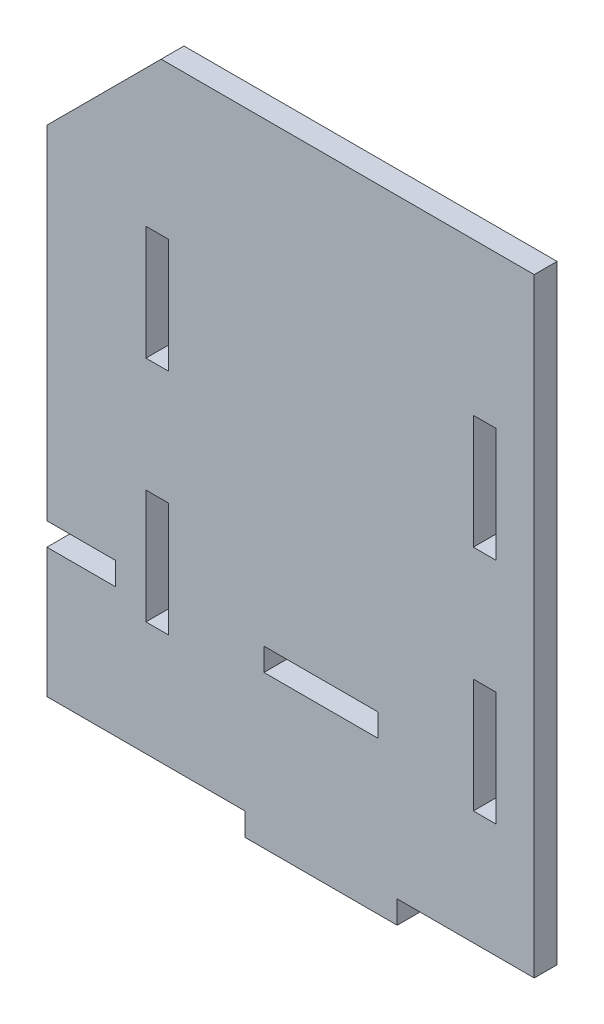
ISO-10303-21;
HEADER;
FILE_DESCRIPTION(('STEP AP214'),'2;1');
FILE_NAME('part.step','',(''),(''),'','','');
FILE_SCHEMA(('AUTOMOTIVE_DESIGN { 1 0 10303 214 1 1 1 1 }'));
ENDSEC;
DATA;
#1=APPLICATION_CONTEXT('core data for automotive mechanical design processes');
#2=APPLICATION_PROTOCOL_DEFINITION('international standard','automotive_design',2000,#1);
#3=PRODUCT_CONTEXT('',#1,'mechanical');
#4=PRODUCT('Part','Part','',(#3));
#5=PRODUCT_RELATED_PRODUCT_CATEGORY('part','',(#4));
#6=PRODUCT_DEFINITION_FORMATION('','',#4);
#7=PRODUCT_DEFINITION_CONTEXT('part definition',#1,'design');
#8=PRODUCT_DEFINITION('design','',#6,#7);
#9=PRODUCT_DEFINITION_SHAPE('','',#8);
#10=(LENGTH_UNIT() NAMED_UNIT(*) SI_UNIT(.MILLI.,.METRE.));
#11=(NAMED_UNIT(*) PLANE_ANGLE_UNIT() SI_UNIT($,.RADIAN.));
#12=(NAMED_UNIT(*) SI_UNIT($,.STERADIAN.) SOLID_ANGLE_UNIT());
#13=UNCERTAINTY_MEASURE_WITH_UNIT(LENGTH_MEASURE(1.E-05),#10,'distance_accuracy_value','');
#14=(GEOMETRIC_REPRESENTATION_CONTEXT(3) GLOBAL_UNCERTAINTY_ASSIGNED_CONTEXT((#13)) GLOBAL_UNIT_ASSIGNED_CONTEXT((#10,
#11,#12)) REPRESENTATION_CONTEXT('',''));
#15=CARTESIAN_POINT('',(0.,0.,0.));
#16=DIRECTION('',(0.,0.,1.));
#17=DIRECTION('',(1.,0.,0.));
#18=AXIS2_PLACEMENT_3D('',#15,#16,#17);
#19=CARTESIAN_POINT('',(-36.,-40.,0.));
#20=DIRECTION('',(-1.,0.,0.));
#21=DIRECTION('',(0.,0.,1.));
#22=AXIS2_PLACEMENT_3D('',#19,#20,#21);
#23=PLANE('',#22);
#24=DIRECTION('',(0.,-1.,0.));
#25=VECTOR('',#24,1.);
#26=CARTESIAN_POINT('',(-36.,-40.,3.));
#27=LINE('',#26,#25);
#28=CARTESIAN_POINT('',(-36.,24.9999999999999,3.));
#29=VERTEX_POINT('',#28);
#30=CARTESIAN_POINT('',(-36.,-20.,3.));
#31=VERTEX_POINT('',#30);
#32=EDGE_CURVE('E327',#29,#31,#27,.T.);
#33=ORIENTED_EDGE('',*,*,#32,.F.);
#34=DIRECTION('',(0.,0.,-1.));
#35=VECTOR('',#34,1.);
#36=CARTESIAN_POINT('',(-36.,24.9999999999999,0.));
#37=LINE('',#36,#35);
#38=CARTESIAN_POINT('',(-36.,24.9999999999999,0.));
#39=VERTEX_POINT('',#38);
#40=EDGE_CURVE('E78',#29,#39,#37,.T.);
#41=ORIENTED_EDGE('',*,*,#40,.T.);
#42=DIRECTION('',(0.,-1.,0.));
#43=VECTOR('',#42,1.);
#44=CARTESIAN_POINT('',(-36.,-40.,0.));
#45=LINE('',#44,#43);
#46=CARTESIAN_POINT('',(-36.,-20.,0.));
#47=VERTEX_POINT('',#46);
#48=EDGE_CURVE('E324',#39,#47,#45,.T.);
#49=ORIENTED_EDGE('',*,*,#48,.T.);
#50=DIRECTION('',(0.,0.,1.));
#51=VECTOR('',#50,1.);
#52=CARTESIAN_POINT('',(-36.,-20.,0.));
#53=LINE('',#52,#51);
#54=EDGE_CURVE('E318',#47,#31,#53,.T.);
#55=ORIENTED_EDGE('',*,*,#54,.T.);
#56=EDGE_LOOP('',(#33,#41,#49,#55));
#57=FACE_BOUND('',#56,.T.);
#58=ADVANCED_FACE('F69',(#57),#23,.T.);
#59=CARTESIAN_POINT('',(-23.,0.,3.));
#60=DIRECTION('',(1.,0.,0.));
#61=DIRECTION('',(0.,0.,-1.));
#62=AXIS2_PLACEMENT_3D('',#59,#60,#61);
#63=PLANE('',#62);
#64=DIRECTION('',(0.,-1.,0.));
#65=VECTOR('',#64,1.);
#66=CARTESIAN_POINT('',(-23.,0.,0.));
#67=LINE('',#66,#65);
#68=CARTESIAN_POINT('',(-23.,20.,0.));
#69=VERTEX_POINT('',#68);
#70=CARTESIAN_POINT('',(-23.,4.99999999999999,0.));
#71=VERTEX_POINT('',#70);
#72=EDGE_CURVE('E368',#69,#71,#67,.T.);
#73=ORIENTED_EDGE('',*,*,#72,.F.);
#74=DIRECTION('',(0.,0.,-1.));
#75=VECTOR('',#74,1.);
#76=CARTESIAN_POINT('',(-23.,20.,3.));
#77=LINE('',#76,#75);
#78=CARTESIAN_POINT('',(-23.,20.,3.));
#79=VERTEX_POINT('',#78);
#80=EDGE_CURVE('E474',#79,#69,#77,.T.);
#81=ORIENTED_EDGE('',*,*,#80,.F.);
#82=DIRECTION('',(0.,-1.,0.));
#83=VECTOR('',#82,1.);
#84=CARTESIAN_POINT('',(-23.,0.,3.));
#85=LINE('',#84,#83);
#86=CARTESIAN_POINT('',(-23.,4.99999999999999,3.));
#87=VERTEX_POINT('',#86);
#88=EDGE_CURVE('E414',#79,#87,#85,.T.);
#89=ORIENTED_EDGE('',*,*,#88,.T.);
#90=DIRECTION('',(0.,0.,-1.));
#91=VECTOR('',#90,1.);
#92=CARTESIAN_POINT('',(-23.,4.99999999999999,3.));
#93=LINE('',#92,#91);
#94=EDGE_CURVE('E476',#87,#71,#93,.T.);
#95=ORIENTED_EDGE('',*,*,#94,.T.);
#96=EDGE_LOOP('',(#73,#81,#89,#95));
#97=FACE_BOUND('',#96,.T.);
#98=ADVANCED_FACE('F565',(#97),#63,.T.);
#99=CARTESIAN_POINT('',(0.,4.99999999999999,3.));
#100=DIRECTION('',(0.,-1.,0.));
#101=DIRECTION('',(0.,0.,-1.));
#102=AXIS2_PLACEMENT_3D('',#99,#100,#101);
#103=PLANE('',#102);
#104=DIRECTION('',(-1.,0.,0.));
#105=VECTOR('',#104,1.);
#106=CARTESIAN_POINT('',(0.,4.99999999999999,0.));
#107=LINE('',#106,#105);
#108=CARTESIAN_POINT('',(-20.,4.99999999999999,0.));
#109=VERTEX_POINT('',#108);
#110=EDGE_CURVE('E469',#109,#71,#107,.T.);
#111=ORIENTED_EDGE('',*,*,#110,.T.);
#112=ORIENTED_EDGE('',*,*,#94,.F.);
#113=DIRECTION('',(-1.,0.,0.));
#114=VECTOR('',#113,1.);
#115=CARTESIAN_POINT('',(0.,4.99999999999999,3.));
#116=LINE('',#115,#114);
#117=CARTESIAN_POINT('',(-20.,4.99999999999999,3.));
#118=VERTEX_POINT('',#117);
#119=EDGE_CURVE('E412',#118,#87,#116,.T.);
#120=ORIENTED_EDGE('',*,*,#119,.F.);
#121=DIRECTION('',(0.,0.,-1.));
#122=VECTOR('',#121,1.);
#123=CARTESIAN_POINT('',(-20.,4.99999999999999,3.));
#124=LINE('',#123,#122);
#125=EDGE_CURVE('E479',#118,#109,#124,.T.);
#126=ORIENTED_EDGE('',*,*,#125,.T.);
#127=EDGE_LOOP('',(#111,#112,#120,#126));
#128=FACE_BOUND('',#127,.T.);
#129=ADVANCED_FACE('F573',(#128),#103,.F.);
#130=CARTESIAN_POINT('',(-20.,0.,3.));
#131=DIRECTION('',(1.,0.,0.));
#132=DIRECTION('',(0.,0.,-1.));
#133=AXIS2_PLACEMENT_3D('',#130,#131,#132);
#134=PLANE('',#133);
#135=DIRECTION('',(0.,-1.,0.));
#136=VECTOR('',#135,1.);
#137=CARTESIAN_POINT('',(-20.,0.,0.));
#138=LINE('',#137,#136);
#139=CARTESIAN_POINT('',(-20.,20.,0.));
#140=VERTEX_POINT('',#139);
#141=EDGE_CURVE('E466',#140,#109,#138,.T.);
#142=ORIENTED_EDGE('',*,*,#141,.T.);
#143=ORIENTED_EDGE('',*,*,#125,.F.);
#144=DIRECTION('',(0.,-1.,0.));
#145=VECTOR('',#144,1.);
#146=CARTESIAN_POINT('',(-20.,0.,3.));
#147=LINE('',#146,#145);
#148=CARTESIAN_POINT('',(-20.,20.,3.));
#149=VERTEX_POINT('',#148);
#150=EDGE_CURVE('E409',#149,#118,#147,.T.);
#151=ORIENTED_EDGE('',*,*,#150,.F.);
#152=DIRECTION('',(0.,0.,-1.));
#153=VECTOR('',#152,1.);
#154=CARTESIAN_POINT('',(-20.,20.,3.));
#155=LINE('',#154,#153);
#156=EDGE_CURVE('E482',#149,#140,#155,.T.);
#157=ORIENTED_EDGE('',*,*,#156,.T.);
#158=EDGE_LOOP('',(#142,#143,#151,#157));
#159=FACE_BOUND('',#158,.T.);
#160=ADVANCED_FACE('F661',(#159),#134,.F.);
#161=CARTESIAN_POINT('',(0.,20.,3.));
#162=DIRECTION('',(0.,-1.,0.));
#163=DIRECTION('',(0.,0.,-1.));
#164=AXIS2_PLACEMENT_3D('',#161,#162,#163);
#165=PLANE('',#164);
#166=DIRECTION('',(-1.,0.,0.));
#167=VECTOR('',#166,1.);
#168=CARTESIAN_POINT('',(0.,20.,0.));
#169=LINE('',#168,#167);
#170=EDGE_CURVE('E463',#140,#69,#169,.T.);
#171=ORIENTED_EDGE('',*,*,#170,.F.);
#172=ORIENTED_EDGE('',*,*,#156,.F.);
#173=DIRECTION('',(-1.,0.,0.));
#174=VECTOR('',#173,1.);
#175=CARTESIAN_POINT('',(0.,20.,3.));
#176=LINE('',#175,#174);
#177=EDGE_CURVE('E406',#149,#79,#176,.T.);
#178=ORIENTED_EDGE('',*,*,#177,.T.);
#179=ORIENTED_EDGE('',*,*,#80,.T.);
#180=EDGE_LOOP('',(#171,#172,#178,#179));
#181=FACE_BOUND('',#180,.T.);
#182=ADVANCED_FACE('F665',(#181),#165,.T.);
#183=CARTESIAN_POINT('',(-23.,0.,3.));
#184=DIRECTION('',(1.,0.,0.));
#185=DIRECTION('',(0.,0.,-1.));
#186=AXIS2_PLACEMENT_3D('',#183,#184,#185);
#187=PLANE('',#186);
#188=DIRECTION('',(0.,-1.,0.));
#189=VECTOR('',#188,1.);
#190=CARTESIAN_POINT('',(-23.,0.,0.));
#191=LINE('',#190,#189);
#192=CARTESIAN_POINT('',(-23.,-10.,0.));
#193=VERTEX_POINT('',#192);
#194=CARTESIAN_POINT('',(-23.,-25.,0.));
#195=VERTEX_POINT('',#194);
#196=EDGE_CURVE('E460',#193,#195,#191,.T.);
#197=ORIENTED_EDGE('',*,*,#196,.F.);
#198=DIRECTION('',(0.,0.,-1.));
#199=VECTOR('',#198,1.);
#200=CARTESIAN_POINT('',(-23.,-10.,3.));
#201=LINE('',#200,#199);
#202=CARTESIAN_POINT('',(-23.,-10.,3.));
#203=VERTEX_POINT('',#202);
#204=EDGE_CURVE('E485',#203,#193,#201,.T.);
#205=ORIENTED_EDGE('',*,*,#204,.F.);
#206=DIRECTION('',(0.,-1.,0.));
#207=VECTOR('',#206,1.);
#208=CARTESIAN_POINT('',(-23.,0.,3.));
#209=LINE('',#208,#207);
#210=CARTESIAN_POINT('',(-23.,-25.,3.));
#211=VERTEX_POINT('',#210);
#212=EDGE_CURVE('E403',#203,#211,#209,.T.);
#213=ORIENTED_EDGE('',*,*,#212,.T.);
#214=DIRECTION('',(0.,0.,-1.));
#215=VECTOR('',#214,1.);
#216=CARTESIAN_POINT('',(-23.,-25.,3.));
#217=LINE('',#216,#215);
#218=EDGE_CURVE('E487',#211,#195,#217,.T.);
#219=ORIENTED_EDGE('',*,*,#218,.T.);
#220=EDGE_LOOP('',(#197,#205,#213,#219));
#221=FACE_BOUND('',#220,.T.);
#222=ADVANCED_FACE('F669',(#221),#187,.T.);
#223=CARTESIAN_POINT('',(0.,-25.,3.));
#224=DIRECTION('',(0.,-1.,0.));
#225=DIRECTION('',(0.,0.,-1.));
#226=AXIS2_PLACEMENT_3D('',#223,#224,#225);
#227=PLANE('',#226);
#228=DIRECTION('',(-1.,0.,0.));
#229=VECTOR('',#228,1.);
#230=CARTESIAN_POINT('',(0.,-25.,0.));
#231=LINE('',#230,#229);
#232=CARTESIAN_POINT('',(-20.,-25.,0.));
#233=VERTEX_POINT('',#232);
#234=EDGE_CURVE('E457',#233,#195,#231,.T.);
#235=ORIENTED_EDGE('',*,*,#234,.T.);
#236=ORIENTED_EDGE('',*,*,#218,.F.);
#237=DIRECTION('',(-1.,0.,0.));
#238=VECTOR('',#237,1.);
#239=CARTESIAN_POINT('',(0.,-25.,3.));
#240=LINE('',#239,#238);
#241=CARTESIAN_POINT('',(-20.,-25.,3.));
#242=VERTEX_POINT('',#241);
#243=EDGE_CURVE('E401',#242,#211,#240,.T.);
#244=ORIENTED_EDGE('',*,*,#243,.F.);
#245=DIRECTION('',(0.,0.,-1.));
#246=VECTOR('',#245,1.);
#247=CARTESIAN_POINT('',(-20.,-25.,3.));
#248=LINE('',#247,#246);
#249=EDGE_CURVE('E490',#242,#233,#248,.T.);
#250=ORIENTED_EDGE('',*,*,#249,.T.);
#251=EDGE_LOOP('',(#235,#236,#244,#250));
#252=FACE_BOUND('',#251,.T.);
#253=ADVANCED_FACE('F673',(#252),#227,.F.);
#254=CARTESIAN_POINT('',(-20.,0.,3.));
#255=DIRECTION('',(1.,0.,0.));
#256=DIRECTION('',(0.,0.,-1.));
#257=AXIS2_PLACEMENT_3D('',#254,#255,#256);
#258=PLANE('',#257);
#259=DIRECTION('',(0.,-1.,0.));
#260=VECTOR('',#259,1.);
#261=CARTESIAN_POINT('',(-20.,0.,0.));
#262=LINE('',#261,#260);
#263=CARTESIAN_POINT('',(-20.,-10.,0.));
#264=VERTEX_POINT('',#263);
#265=EDGE_CURVE('E454',#264,#233,#262,.T.);
#266=ORIENTED_EDGE('',*,*,#265,.T.);
#267=ORIENTED_EDGE('',*,*,#249,.F.);
#268=DIRECTION('',(0.,-1.,0.));
#269=VECTOR('',#268,1.);
#270=CARTESIAN_POINT('',(-20.,0.,3.));
#271=LINE('',#270,#269);
#272=CARTESIAN_POINT('',(-20.,-10.,3.));
#273=VERTEX_POINT('',#272);
#274=EDGE_CURVE('E398',#273,#242,#271,.T.);
#275=ORIENTED_EDGE('',*,*,#274,.F.);
#276=DIRECTION('',(0.,0.,-1.));
#277=VECTOR('',#276,1.);
#278=CARTESIAN_POINT('',(-20.,-10.,3.));
#279=LINE('',#278,#277);
#280=EDGE_CURVE('E477',#273,#264,#279,.T.);
#281=ORIENTED_EDGE('',*,*,#280,.T.);
#282=EDGE_LOOP('',(#266,#267,#275,#281));
#283=FACE_BOUND('',#282,.T.);
#284=ADVANCED_FACE('F677',(#283),#258,.F.);
#285=CARTESIAN_POINT('',(0.,-10.,3.));
#286=DIRECTION('',(0.,-1.,0.));
#287=DIRECTION('',(0.,0.,-1.));
#288=AXIS2_PLACEMENT_3D('',#285,#286,#287);
#289=PLANE('',#288);
#290=DIRECTION('',(-1.,0.,0.));
#291=VECTOR('',#290,1.);
#292=CARTESIAN_POINT('',(0.,-10.,0.));
#293=LINE('',#292,#291);
#294=EDGE_CURVE('E451',#264,#193,#293,.T.);
#295=ORIENTED_EDGE('',*,*,#294,.F.);
#296=ORIENTED_EDGE('',*,*,#280,.F.);
#297=DIRECTION('',(-1.,0.,0.));
#298=VECTOR('',#297,1.);
#299=CARTESIAN_POINT('',(0.,-10.,3.));
#300=LINE('',#299,#298);
#301=EDGE_CURVE('E395',#273,#203,#300,.T.);
#302=ORIENTED_EDGE('',*,*,#301,.T.);
#303=ORIENTED_EDGE('',*,*,#204,.T.);
#304=EDGE_LOOP('',(#295,#296,#302,#303));
#305=FACE_BOUND('',#304,.T.);
#306=ADVANCED_FACE('F681',(#305),#289,.T.);
#307=CARTESIAN_POINT('',(20.,0.,3.));
#308=DIRECTION('',(1.,0.,0.));
#309=DIRECTION('',(0.,0.,-1.));
#310=AXIS2_PLACEMENT_3D('',#307,#308,#309);
#311=PLANE('',#310);
#312=DIRECTION('',(0.,-1.,0.));
#313=VECTOR('',#312,1.);
#314=CARTESIAN_POINT('',(20.,0.,0.));
#315=LINE('',#314,#313);
#316=CARTESIAN_POINT('',(20.,-10.,0.));
#317=VERTEX_POINT('',#316);
#318=CARTESIAN_POINT('',(20.,-25.,0.));
#319=VERTEX_POINT('',#318);
#320=EDGE_CURVE('E448',#317,#319,#315,.T.);
#321=ORIENTED_EDGE('',*,*,#320,.F.);
#322=DIRECTION('',(0.,0.,-1.));
#323=VECTOR('',#322,1.);
#324=CARTESIAN_POINT('',(20.,-10.,3.));
#325=LINE('',#324,#323);
#326=CARTESIAN_POINT('',(20.,-10.,3.));
#327=VERTEX_POINT('',#326);
#328=EDGE_CURVE('E494',#327,#317,#325,.T.);
#329=ORIENTED_EDGE('',*,*,#328,.F.);
#330=DIRECTION('',(0.,-1.,0.));
#331=VECTOR('',#330,1.);
#332=CARTESIAN_POINT('',(20.,0.,3.));
#333=LINE('',#332,#331);
#334=CARTESIAN_POINT('',(20.,-25.,3.));
#335=VERTEX_POINT('',#334);
#336=EDGE_CURVE('E392',#327,#335,#333,.T.);
#337=ORIENTED_EDGE('',*,*,#336,.T.);
#338=DIRECTION('',(0.,0.,-1.));
#339=VECTOR('',#338,1.);
#340=CARTESIAN_POINT('',(20.,-25.,3.));
#341=LINE('',#340,#339);
#342=EDGE_CURVE('E496',#335,#319,#341,.T.);
#343=ORIENTED_EDGE('',*,*,#342,.T.);
#344=EDGE_LOOP('',(#321,#329,#337,#343));
#345=FACE_BOUND('',#344,.T.);
#346=ADVANCED_FACE('F685',(#345),#311,.T.);
#347=CARTESIAN_POINT('',(0.,-25.,3.));
#348=DIRECTION('',(0.,1.,0.));
#349=DIRECTION('',(0.,0.,1.));
#350=AXIS2_PLACEMENT_3D('',#347,#348,#349);
#351=PLANE('',#350);
#352=DIRECTION('',(1.,0.,0.));
#353=VECTOR('',#352,1.);
#354=CARTESIAN_POINT('',(0.,-25.,0.));
#355=LINE('',#354,#353);
#356=CARTESIAN_POINT('',(23.,-25.,0.));
#357=VERTEX_POINT('',#356);
#358=EDGE_CURVE('E445',#319,#357,#355,.T.);
#359=ORIENTED_EDGE('',*,*,#358,.F.);
#360=ORIENTED_EDGE('',*,*,#342,.F.);
#361=DIRECTION('',(1.,0.,0.));
#362=VECTOR('',#361,1.);
#363=CARTESIAN_POINT('',(0.,-25.,3.));
#364=LINE('',#363,#362);
#365=CARTESIAN_POINT('',(23.,-25.,3.));
#366=VERTEX_POINT('',#365);
#367=EDGE_CURVE('E389',#335,#366,#364,.T.);
#368=ORIENTED_EDGE('',*,*,#367,.T.);
#369=DIRECTION('',(0.,0.,-1.));
#370=VECTOR('',#369,1.);
#371=CARTESIAN_POINT('',(23.,-25.,3.));
#372=LINE('',#371,#370);
#373=EDGE_CURVE('E499',#366,#357,#372,.T.);
#374=ORIENTED_EDGE('',*,*,#373,.T.);
#375=EDGE_LOOP('',(#359,#360,#368,#374));
#376=FACE_BOUND('',#375,.T.);
#377=ADVANCED_FACE('F689',(#376),#351,.T.);
#378=CARTESIAN_POINT('',(23.,0.,3.));
#379=DIRECTION('',(1.,0.,0.));
#380=DIRECTION('',(0.,0.,-1.));
#381=AXIS2_PLACEMENT_3D('',#378,#379,#380);
#382=PLANE('',#381);
#383=DIRECTION('',(0.,-1.,0.));
#384=VECTOR('',#383,1.);
#385=CARTESIAN_POINT('',(23.,0.,0.));
#386=LINE('',#385,#384);
#387=CARTESIAN_POINT('',(23.,-10.,0.));
#388=VERTEX_POINT('',#387);
#389=EDGE_CURVE('E442',#388,#357,#386,.T.);
#390=ORIENTED_EDGE('',*,*,#389,.T.);
#391=ORIENTED_EDGE('',*,*,#373,.F.);
#392=DIRECTION('',(0.,-1.,0.));
#393=VECTOR('',#392,1.);
#394=CARTESIAN_POINT('',(23.,0.,3.));
#395=LINE('',#394,#393);
#396=CARTESIAN_POINT('',(23.,-10.,3.));
#397=VERTEX_POINT('',#396);
#398=EDGE_CURVE('E387',#397,#366,#395,.T.);
#399=ORIENTED_EDGE('',*,*,#398,.F.);
#400=DIRECTION('',(0.,0.,-1.));
#401=VECTOR('',#400,1.);
#402=CARTESIAN_POINT('',(23.,-10.,3.));
#403=LINE('',#402,#401);
#404=EDGE_CURVE('E488',#397,#388,#403,.T.);
#405=ORIENTED_EDGE('',*,*,#404,.T.);
#406=EDGE_LOOP('',(#390,#391,#399,#405));
#407=FACE_BOUND('',#406,.T.);
#408=ADVANCED_FACE('F692',(#407),#382,.F.);
#409=CARTESIAN_POINT('',(0.,-10.,3.));
#410=DIRECTION('',(0.,1.,0.));
#411=DIRECTION('',(0.,0.,1.));
#412=AXIS2_PLACEMENT_3D('',#409,#410,#411);
#413=PLANE('',#412);
#414=DIRECTION('',(1.,0.,0.));
#415=VECTOR('',#414,1.);
#416=CARTESIAN_POINT('',(0.,-10.,0.));
#417=LINE('',#416,#415);
#418=EDGE_CURVE('E439',#317,#388,#417,.T.);
#419=ORIENTED_EDGE('',*,*,#418,.T.);
#420=ORIENTED_EDGE('',*,*,#404,.F.);
#421=DIRECTION('',(1.,0.,0.));
#422=VECTOR('',#421,1.);
#423=CARTESIAN_POINT('',(0.,-10.,3.));
#424=LINE('',#423,#422);
#425=EDGE_CURVE('E384',#327,#397,#424,.T.);
#426=ORIENTED_EDGE('',*,*,#425,.F.);
#427=ORIENTED_EDGE('',*,*,#328,.T.);
#428=EDGE_LOOP('',(#419,#420,#426,#427));
#429=FACE_BOUND('',#428,.T.);
#430=ADVANCED_FACE('F621',(#429),#413,.F.);
#431=CARTESIAN_POINT('',(0.,40.,3.));
#432=DIRECTION('',(0.,1.,0.));
#433=DIRECTION('',(0.,0.,1.));
#434=AXIS2_PLACEMENT_3D('',#431,#432,#433);
#435=PLANE('',#434);
#436=DIRECTION('',(1.,0.,0.));
#437=VECTOR('',#436,1.);
#438=CARTESIAN_POINT('',(0.,40.,0.));
#439=LINE('',#438,#437);
#440=CARTESIAN_POINT('',(-21.,40.,0.));
#441=VERTEX_POINT('',#440);
#442=CARTESIAN_POINT('',(28.,40.,0.));
#443=VERTEX_POINT('',#442);
#444=EDGE_CURVE('E433',#441,#443,#439,.T.);
#445=ORIENTED_EDGE('',*,*,#444,.F.);
#446=DIRECTION('',(0.,0.,1.));
#447=VECTOR('',#446,1.);
#448=CARTESIAN_POINT('',(-21.,40.,3.));
#449=LINE('',#448,#447);
#450=CARTESIAN_POINT('',(-21.,40.,3.));
#451=VERTEX_POINT('',#450);
#452=EDGE_CURVE('E535',#441,#451,#449,.T.);
#453=ORIENTED_EDGE('',*,*,#452,.T.);
#454=DIRECTION('',(1.,0.,0.));
#455=VECTOR('',#454,1.);
#456=CARTESIAN_POINT('',(0.,40.,3.));
#457=LINE('',#456,#455);
#458=CARTESIAN_POINT('',(28.,40.,3.));
#459=VERTEX_POINT('',#458);
#460=EDGE_CURVE('E378',#451,#459,#457,.T.);
#461=ORIENTED_EDGE('',*,*,#460,.T.);
#462=DIRECTION('',(0.,0.,-1.));
#463=VECTOR('',#462,1.);
#464=CARTESIAN_POINT('',(28.,40.,3.));
#465=LINE('',#464,#463);
#466=EDGE_CURVE('E497',#459,#443,#465,.T.);
#467=ORIENTED_EDGE('',*,*,#466,.T.);
#468=EDGE_LOOP('',(#445,#453,#461,#467));
#469=FACE_BOUND('',#468,.T.);
#470=ADVANCED_FACE('F545',(#469),#435,.T.);
#471=CARTESIAN_POINT('',(23.,0.,3.));
#472=DIRECTION('',(1.,0.,0.));
#473=DIRECTION('',(0.,0.,-1.));
#474=AXIS2_PLACEMENT_3D('',#471,#472,#473);
#475=PLANE('',#474);
#476=DIRECTION('',(0.,-1.,0.));
#477=VECTOR('',#476,1.);
#478=CARTESIAN_POINT('',(23.,0.,0.));
#479=LINE('',#478,#477);
#480=CARTESIAN_POINT('',(23.,20.,0.));
#481=VERTEX_POINT('',#480);
#482=CARTESIAN_POINT('',(23.,4.99999999999999,0.));
#483=VERTEX_POINT('',#482);
#484=EDGE_CURVE('E427',#481,#483,#479,.T.);
#485=ORIENTED_EDGE('',*,*,#484,.T.);
#486=DIRECTION('',(0.,0.,-1.));
#487=VECTOR('',#486,1.);
#488=CARTESIAN_POINT('',(23.,4.99999999999999,3.));
#489=LINE('',#488,#487);
#490=CARTESIAN_POINT('',(23.,4.99999999999999,3.));
#491=VERTEX_POINT('',#490);
#492=EDGE_CURVE('E417',#491,#483,#489,.T.);
#493=ORIENTED_EDGE('',*,*,#492,.F.);
#494=DIRECTION('',(0.,-1.,0.));
#495=VECTOR('',#494,1.);
#496=CARTESIAN_POINT('',(23.,0.,3.));
#497=LINE('',#496,#495);
#498=CARTESIAN_POINT('',(23.,20.,3.));
#499=VERTEX_POINT('',#498);
#500=EDGE_CURVE('E373',#499,#491,#497,.T.);
#501=ORIENTED_EDGE('',*,*,#500,.F.);
#502=DIRECTION('',(0.,0.,-1.));
#503=VECTOR('',#502,1.);
#504=CARTESIAN_POINT('',(23.,20.,3.));
#505=LINE('',#504,#503);
#506=EDGE_CURVE('E510',#499,#481,#505,.T.);
#507=ORIENTED_EDGE('',*,*,#506,.T.);
#508=EDGE_LOOP('',(#485,#493,#501,#507));
#509=FACE_BOUND('',#508,.T.);
#510=ADVANCED_FACE('F624',(#509),#475,.F.);
#511=CARTESIAN_POINT('',(0.,20.,3.));
#512=DIRECTION('',(0.,1.,0.));
#513=DIRECTION('',(0.,0.,1.));
#514=AXIS2_PLACEMENT_3D('',#511,#512,#513);
#515=PLANE('',#514);
#516=DIRECTION('',(1.,0.,0.));
#517=VECTOR('',#516,1.);
#518=CARTESIAN_POINT('',(0.,20.,0.));
#519=LINE('',#518,#517);
#520=CARTESIAN_POINT('',(20.,20.,0.));
#521=VERTEX_POINT('',#520);
#522=EDGE_CURVE('E425',#521,#481,#519,.T.);
#523=ORIENTED_EDGE('',*,*,#522,.T.);
#524=ORIENTED_EDGE('',*,*,#506,.F.);
#525=DIRECTION('',(1.,0.,0.));
#526=VECTOR('',#525,1.);
#527=CARTESIAN_POINT('',(0.,20.,3.));
#528=LINE('',#527,#526);
#529=CARTESIAN_POINT('',(20.,20.,3.));
#530=VERTEX_POINT('',#529);
#531=EDGE_CURVE('E371',#530,#499,#528,.T.);
#532=ORIENTED_EDGE('',*,*,#531,.F.);
#533=DIRECTION('',(0.,0.,-1.));
#534=VECTOR('',#533,1.);
#535=CARTESIAN_POINT('',(20.,20.,3.));
#536=LINE('',#535,#534);
#537=EDGE_CURVE('E513',#530,#521,#536,.T.);
#538=ORIENTED_EDGE('',*,*,#537,.T.);
#539=EDGE_LOOP('',(#523,#524,#532,#538));
#540=FACE_BOUND('',#539,.T.);
#541=ADVANCED_FACE('F629',(#540),#515,.F.);
#542=CARTESIAN_POINT('',(20.,0.,3.));
#543=DIRECTION('',(1.,0.,0.));
#544=DIRECTION('',(0.,0.,-1.));
#545=AXIS2_PLACEMENT_3D('',#542,#543,#544);
#546=PLANE('',#545);
#547=DIRECTION('',(0.,-1.,0.));
#548=VECTOR('',#547,1.);
#549=CARTESIAN_POINT('',(20.,0.,0.));
#550=LINE('',#549,#548);
#551=CARTESIAN_POINT('',(20.,4.99999999999999,0.));
#552=VERTEX_POINT('',#551);
#553=EDGE_CURVE('E421',#521,#552,#550,.T.);
#554=ORIENTED_EDGE('',*,*,#553,.F.);
#555=ORIENTED_EDGE('',*,*,#537,.F.);
#556=DIRECTION('',(0.,-1.,0.));
#557=VECTOR('',#556,1.);
#558=CARTESIAN_POINT('',(20.,0.,3.));
#559=LINE('',#558,#557);
#560=CARTESIAN_POINT('',(20.,4.99999999999999,3.));
#561=VERTEX_POINT('',#560);
#562=EDGE_CURVE('E367',#530,#561,#559,.T.);
#563=ORIENTED_EDGE('',*,*,#562,.T.);
#564=DIRECTION('',(0.,0.,-1.));
#565=VECTOR('',#564,1.);
#566=CARTESIAN_POINT('',(20.,4.99999999999999,3.));
#567=LINE('',#566,#565);
#568=EDGE_CURVE('E506',#561,#552,#567,.T.);
#569=ORIENTED_EDGE('',*,*,#568,.T.);
#570=EDGE_LOOP('',(#554,#555,#563,#569));
#571=FACE_BOUND('',#570,.T.);
#572=ADVANCED_FACE('F633',(#571),#546,.T.);
#573=CARTESIAN_POINT('',(0.,4.99999999999999,3.));
#574=DIRECTION('',(0.,1.,0.));
#575=DIRECTION('',(0.,0.,1.));
#576=AXIS2_PLACEMENT_3D('',#573,#574,#575);
#577=PLANE('',#576);
#578=DIRECTION('',(1.,0.,0.));
#579=VECTOR('',#578,1.);
#580=CARTESIAN_POINT('',(0.,4.99999999999999,0.));
#581=LINE('',#580,#579);
#582=EDGE_CURVE('E418',#552,#483,#581,.T.);
#583=ORIENTED_EDGE('',*,*,#582,.F.);
#584=ORIENTED_EDGE('',*,*,#568,.F.);
#585=DIRECTION('',(1.,0.,0.));
#586=VECTOR('',#585,1.);
#587=CARTESIAN_POINT('',(0.,4.99999999999999,3.));
#588=LINE('',#587,#586);
#589=EDGE_CURVE('E364',#561,#491,#588,.T.);
#590=ORIENTED_EDGE('',*,*,#589,.T.);
#591=ORIENTED_EDGE('',*,*,#492,.T.);
#592=EDGE_LOOP('',(#583,#584,#590,#591));
#593=FACE_BOUND('',#592,.T.);
#594=ADVANCED_FACE('F626',(#593),#577,.T.);
#595=CARTESIAN_POINT('',(28.,0.,3.));
#596=DIRECTION('',(1.,0.,0.));
#597=DIRECTION('',(0.,1.,0.));
#598=AXIS2_PLACEMENT_3D('',#595,#596,#597);
#599=PLANE('',#598);
#600=DIRECTION('',(0.,-1.,0.));
#601=VECTOR('',#600,1.);
#602=CARTESIAN_POINT('',(28.,0.,0.));
#603=LINE('',#602,#601);
#604=CARTESIAN_POINT('',(28.,-40.,0.));
#605=VERTEX_POINT('',#604);
#606=EDGE_CURVE('E430',#443,#605,#603,.T.);
#607=ORIENTED_EDGE('',*,*,#606,.F.);
#608=ORIENTED_EDGE('',*,*,#466,.F.);
#609=DIRECTION('',(0.,-1.,0.));
#610=VECTOR('',#609,1.);
#611=CARTESIAN_POINT('',(28.,0.,3.));
#612=LINE('',#611,#610);
#613=CARTESIAN_POINT('',(28.,-40.,3.));
#614=VERTEX_POINT('',#613);
#615=EDGE_CURVE('E375',#459,#614,#612,.T.);
#616=ORIENTED_EDGE('',*,*,#615,.T.);
#617=DIRECTION('',(0.,0.,-1.));
#618=VECTOR('',#617,1.);
#619=CARTESIAN_POINT('',(28.,-40.,3.));
#620=LINE('',#619,#618);
#621=EDGE_CURVE('E503',#614,#605,#620,.T.);
#622=ORIENTED_EDGE('',*,*,#621,.T.);
#623=EDGE_LOOP('',(#607,#608,#616,#622));
#624=FACE_BOUND('',#623,.T.);
#625=ADVANCED_FACE('F557',(#624),#599,.T.);
#626=CARTESIAN_POINT('',(0.,0.,0.));
#627=DIRECTION('',(0.,0.,1.));
#628=DIRECTION('',(1.,0.,0.));
#629=AXIS2_PLACEMENT_3D('',#626,#627,#628);
#630=PLANE('',#629);
#631=DIRECTION('',(-1.,0.,0.));
#632=VECTOR('',#631,1.);
#633=CARTESIAN_POINT('',(-7.5,-20.,0.));
#634=LINE('',#633,#632);
#635=CARTESIAN_POINT('',(7.5,-20.,0.));
#636=VERTEX_POINT('',#635);
#637=CARTESIAN_POINT('',(-7.5,-20.,0.));
#638=VERTEX_POINT('',#637);
#639=EDGE_CURVE('E342',#636,#638,#634,.T.);
#640=ORIENTED_EDGE('',*,*,#639,.T.);
#641=DIRECTION('',(0.,-1.,0.));
#642=VECTOR('',#641,1.);
#643=CARTESIAN_POINT('',(-7.5,-20.,0.));
#644=LINE('',#643,#642);
#645=CARTESIAN_POINT('',(-7.5,-23.,0.));
#646=VERTEX_POINT('',#645);
#647=EDGE_CURVE('E332',#638,#646,#644,.T.);
#648=ORIENTED_EDGE('',*,*,#647,.T.);
#649=DIRECTION('',(1.,0.,0.));
#650=VECTOR('',#649,1.);
#651=CARTESIAN_POINT('',(-7.5,-23.,0.));
#652=LINE('',#651,#650);
#653=CARTESIAN_POINT('',(7.5,-23.,0.));
#654=VERTEX_POINT('',#653);
#655=EDGE_CURVE('E335',#646,#654,#652,.T.);
#656=ORIENTED_EDGE('',*,*,#655,.T.);
#657=DIRECTION('',(0.,1.,0.));
#658=VECTOR('',#657,1.);
#659=CARTESIAN_POINT('',(7.5,-20.,0.));
#660=LINE('',#659,#658);
#661=EDGE_CURVE('E339',#654,#636,#660,.T.);
#662=ORIENTED_EDGE('',*,*,#661,.T.);
#663=EDGE_LOOP('',(#640,#648,#656,#662));
#664=FACE_BOUND('',#663,.T.);
#665=ORIENTED_EDGE('',*,*,#582,.T.);
#666=ORIENTED_EDGE('',*,*,#484,.F.);
#667=ORIENTED_EDGE('',*,*,#522,.F.);
#668=ORIENTED_EDGE('',*,*,#553,.T.);
#669=EDGE_LOOP('',(#665,#666,#667,#668));
#670=FACE_BOUND('',#669,.T.);
#671=ORIENTED_EDGE('',*,*,#48,.F.);
#672=DIRECTION('',(-0.707106781186546,-0.707106781186549,0.));
#673=VECTOR('',#672,1.);
#674=CARTESIAN_POINT('',(-21.,40.,0.));
#675=LINE('',#674,#673);
#676=EDGE_CURVE('E12',#39,#441,#675,.F.);
#677=ORIENTED_EDGE('',*,*,#676,.T.);
#678=ORIENTED_EDGE('',*,*,#444,.T.);
#679=ORIENTED_EDGE('',*,*,#606,.T.);
#680=DIRECTION('',(1.,0.,0.));
#681=VECTOR('',#680,1.);
#682=CARTESIAN_POINT('',(0.,-40.,0.));
#683=LINE('',#682,#681);
#684=CARTESIAN_POINT('',(10.,-40.,0.));
#685=VERTEX_POINT('',#684);
#686=EDGE_CURVE('E435',#685,#605,#683,.T.);
#687=ORIENTED_EDGE('',*,*,#686,.F.);
#688=DIRECTION('',(0.,-1.,0.));
#689=VECTOR('',#688,1.);
#690=CARTESIAN_POINT('',(10.,-40.,0.));
#691=LINE('',#690,#689);
#692=CARTESIAN_POINT('',(10.,-43.,0.));
#693=VERTEX_POINT('',#692);
#694=EDGE_CURVE('E520',#685,#693,#691,.T.);
#695=ORIENTED_EDGE('',*,*,#694,.T.);
#696=DIRECTION('',(1.,0.,0.));
#697=VECTOR('',#696,1.);
#698=CARTESIAN_POINT('',(-10.,-43.,0.));
#699=LINE('',#698,#697);
#700=CARTESIAN_POINT('',(-10.,-43.,0.));
#701=VERTEX_POINT('',#700);
#702=EDGE_CURVE('E528',#701,#693,#699,.T.);
#703=ORIENTED_EDGE('',*,*,#702,.F.);
#704=DIRECTION('',(0.,-1.,0.));
#705=VECTOR('',#704,1.);
#706=CARTESIAN_POINT('',(-10.,-40.,0.));
#707=LINE('',#706,#705);
#708=CARTESIAN_POINT('',(-10.,-40.,0.));
#709=VERTEX_POINT('',#708);
#710=EDGE_CURVE('E357',#709,#701,#707,.T.);
#711=ORIENTED_EDGE('',*,*,#710,.F.);
#712=CARTESIAN_POINT('',(-36.,-40.,0.));
#713=VERTEX_POINT('',#712);
#714=EDGE_CURVE('E436',#713,#709,#683,.T.);
#715=ORIENTED_EDGE('',*,*,#714,.F.);
#716=CARTESIAN_POINT('',(-36.,-23.,0.));
#717=VERTEX_POINT('',#716);
#718=EDGE_CURVE('E308',#717,#713,#45,.T.);
#719=ORIENTED_EDGE('',*,*,#718,.F.);
#720=DIRECTION('',(1.,0.,0.));
#721=VECTOR('',#720,1.);
#722=CARTESIAN_POINT('',(-36.,-23.,0.));
#723=LINE('',#722,#721);
#724=CARTESIAN_POINT('',(-27.,-23.,0.));
#725=VERTEX_POINT('',#724);
#726=EDGE_CURVE('E286',#717,#725,#723,.T.);
#727=ORIENTED_EDGE('',*,*,#726,.T.);
#728=DIRECTION('',(0.,1.,0.));
#729=VECTOR('',#728,1.);
#730=CARTESIAN_POINT('',(-27.,-23.,0.));
#731=LINE('',#730,#729);
#732=CARTESIAN_POINT('',(-27.,-20.,0.));
#733=VERTEX_POINT('',#732);
#734=EDGE_CURVE('E297',#725,#733,#731,.T.);
#735=ORIENTED_EDGE('',*,*,#734,.T.);
#736=DIRECTION('',(-1.,0.,0.));
#737=VECTOR('',#736,1.);
#738=CARTESIAN_POINT('',(-36.,-20.,0.));
#739=LINE('',#738,#737);
#740=EDGE_CURVE('E302',#733,#47,#739,.T.);
#741=ORIENTED_EDGE('',*,*,#740,.T.);
#742=EDGE_LOOP('',(#671,#677,#678,#679,#687,#695,#703,#711,#715,#719,#727,#735,#741));
#743=FACE_BOUND('',#742,.T.);
#744=ORIENTED_EDGE('',*,*,#418,.F.);
#745=ORIENTED_EDGE('',*,*,#320,.T.);
#746=ORIENTED_EDGE('',*,*,#358,.T.);
#747=ORIENTED_EDGE('',*,*,#389,.F.);
#748=EDGE_LOOP('',(#744,#745,#746,#747));
#749=FACE_BOUND('',#748,.T.);
#750=ORIENTED_EDGE('',*,*,#294,.T.);
#751=ORIENTED_EDGE('',*,*,#196,.T.);
#752=ORIENTED_EDGE('',*,*,#234,.F.);
#753=ORIENTED_EDGE('',*,*,#265,.F.);
#754=EDGE_LOOP('',(#750,#751,#752,#753));
#755=FACE_BOUND('',#754,.T.);
#756=ORIENTED_EDGE('',*,*,#170,.T.);
#757=ORIENTED_EDGE('',*,*,#72,.T.);
#758=ORIENTED_EDGE('',*,*,#110,.F.);
#759=ORIENTED_EDGE('',*,*,#141,.F.);
#760=EDGE_LOOP('',(#756,#757,#758,#759));
#761=FACE_BOUND('',#760,.T.);
#762=ADVANCED_FACE('F305',(#664,#670,#743,#749,#755,#761),#630,.F.);
#763=CARTESIAN_POINT('',(0.,0.,3.));
#764=DIRECTION('',(0.,0.,1.));
#765=DIRECTION('',(1.,0.,0.));
#766=AXIS2_PLACEMENT_3D('',#763,#764,#765);
#767=PLANE('',#766);
#768=ORIENTED_EDGE('',*,*,#460,.F.);
#769=DIRECTION('',(0.707106781186546,0.707106781186549,0.));
#770=VECTOR('',#769,1.);
#771=CARTESIAN_POINT('',(-30.5,30.4999999999999,3.));
#772=LINE('',#771,#770);
#773=EDGE_CURVE('E92',#451,#29,#772,.F.);
#774=ORIENTED_EDGE('',*,*,#773,.T.);
#775=ORIENTED_EDGE('',*,*,#32,.T.);
#776=DIRECTION('',(-1.,0.,0.));
#777=VECTOR('',#776,1.);
#778=CARTESIAN_POINT('',(-36.,-20.,3.));
#779=LINE('',#778,#777);
#780=CARTESIAN_POINT('',(-27.,-20.,3.));
#781=VERTEX_POINT('',#780);
#782=EDGE_CURVE('E309',#781,#31,#779,.T.);
#783=ORIENTED_EDGE('',*,*,#782,.F.);
#784=DIRECTION('',(0.,1.,0.));
#785=VECTOR('',#784,1.);
#786=CARTESIAN_POINT('',(-27.,-23.,3.));
#787=LINE('',#786,#785);
#788=CARTESIAN_POINT('',(-27.,-23.,3.));
#789=VERTEX_POINT('',#788);
#790=EDGE_CURVE('E312',#789,#781,#787,.T.);
#791=ORIENTED_EDGE('',*,*,#790,.F.);
#792=DIRECTION('',(1.,0.,0.));
#793=VECTOR('',#792,1.);
#794=CARTESIAN_POINT('',(-36.,-23.,3.));
#795=LINE('',#794,#793);
#796=CARTESIAN_POINT('',(-36.,-23.,3.));
#797=VERTEX_POINT('',#796);
#798=EDGE_CURVE('E289',#797,#789,#795,.T.);
#799=ORIENTED_EDGE('',*,*,#798,.F.);
#800=CARTESIAN_POINT('',(-36.,-40.,3.));
#801=VERTEX_POINT('',#800);
#802=EDGE_CURVE('E321',#797,#801,#27,.T.);
#803=ORIENTED_EDGE('',*,*,#802,.T.);
#804=DIRECTION('',(1.,0.,0.));
#805=VECTOR('',#804,1.);
#806=CARTESIAN_POINT('',(0.,-40.,3.));
#807=LINE('',#806,#805);
#808=CARTESIAN_POINT('',(-10.,-40.,3.));
#809=VERTEX_POINT('',#808);
#810=EDGE_CURVE('E381',#801,#809,#807,.T.);
#811=ORIENTED_EDGE('',*,*,#810,.T.);
#812=DIRECTION('',(0.,-1.,0.));
#813=VECTOR('',#812,1.);
#814=CARTESIAN_POINT('',(-10.,-40.,3.));
#815=LINE('',#814,#813);
#816=CARTESIAN_POINT('',(-10.,-43.,3.));
#817=VERTEX_POINT('',#816);
#818=EDGE_CURVE('E516',#809,#817,#815,.T.);
#819=ORIENTED_EDGE('',*,*,#818,.T.);
#820=DIRECTION('',(1.,0.,0.));
#821=VECTOR('',#820,1.);
#822=CARTESIAN_POINT('',(-10.,-43.,3.));
#823=LINE('',#822,#821);
#824=CARTESIAN_POINT('',(10.,-43.,3.));
#825=VERTEX_POINT('',#824);
#826=EDGE_CURVE('E519',#817,#825,#823,.T.);
#827=ORIENTED_EDGE('',*,*,#826,.T.);
#828=DIRECTION('',(0.,-1.,0.));
#829=VECTOR('',#828,1.);
#830=CARTESIAN_POINT('',(10.,-40.,3.));
#831=LINE('',#830,#829);
#832=CARTESIAN_POINT('',(10.,-40.,3.));
#833=VERTEX_POINT('',#832);
#834=EDGE_CURVE('E522',#833,#825,#831,.T.);
#835=ORIENTED_EDGE('',*,*,#834,.F.);
#836=EDGE_CURVE('E380',#833,#614,#807,.T.);
#837=ORIENTED_EDGE('',*,*,#836,.T.);
#838=ORIENTED_EDGE('',*,*,#615,.F.);
#839=EDGE_LOOP('',(#768,#774,#775,#783,#791,#799,#803,#811,#819,#827,#835,#837,#838));
#840=FACE_BOUND('',#839,.T.);
#841=DIRECTION('',(0.,-1.,0.));
#842=VECTOR('',#841,1.);
#843=CARTESIAN_POINT('',(-7.5,-20.,3.));
#844=LINE('',#843,#842);
#845=CARTESIAN_POINT('',(-7.5,-20.,3.));
#846=VERTEX_POINT('',#845);
#847=CARTESIAN_POINT('',(-7.5,-23.,3.));
#848=VERTEX_POINT('',#847);
#849=EDGE_CURVE('E331',#846,#848,#844,.T.);
#850=ORIENTED_EDGE('',*,*,#849,.F.);
#851=DIRECTION('',(-1.,0.,0.));
#852=VECTOR('',#851,1.);
#853=CARTESIAN_POINT('',(-7.5,-20.,3.));
#854=LINE('',#853,#852);
#855=CARTESIAN_POINT('',(7.5,-20.,3.));
#856=VERTEX_POINT('',#855);
#857=EDGE_CURVE('E336',#856,#846,#854,.T.);
#858=ORIENTED_EDGE('',*,*,#857,.F.);
#859=DIRECTION('',(0.,1.,0.));
#860=VECTOR('',#859,1.);
#861=CARTESIAN_POINT('',(7.5,-20.,3.));
#862=LINE('',#861,#860);
#863=CARTESIAN_POINT('',(7.5,-23.,3.));
#864=VERTEX_POINT('',#863);
#865=EDGE_CURVE('E350',#864,#856,#862,.T.);
#866=ORIENTED_EDGE('',*,*,#865,.F.);
#867=DIRECTION('',(1.,0.,0.));
#868=VECTOR('',#867,1.);
#869=CARTESIAN_POINT('',(-7.5,-23.,3.));
#870=LINE('',#869,#868);
#871=EDGE_CURVE('E347',#848,#864,#870,.T.);
#872=ORIENTED_EDGE('',*,*,#871,.F.);
#873=EDGE_LOOP('',(#850,#858,#866,#872));
#874=FACE_BOUND('',#873,.T.);
#875=ORIENTED_EDGE('',*,*,#589,.F.);
#876=ORIENTED_EDGE('',*,*,#562,.F.);
#877=ORIENTED_EDGE('',*,*,#531,.T.);
#878=ORIENTED_EDGE('',*,*,#500,.T.);
#879=EDGE_LOOP('',(#875,#876,#877,#878));
#880=FACE_BOUND('',#879,.T.);
#881=ORIENTED_EDGE('',*,*,#425,.T.);
#882=ORIENTED_EDGE('',*,*,#398,.T.);
#883=ORIENTED_EDGE('',*,*,#367,.F.);
#884=ORIENTED_EDGE('',*,*,#336,.F.);
#885=EDGE_LOOP('',(#881,#882,#883,#884));
#886=FACE_BOUND('',#885,.T.);
#887=ORIENTED_EDGE('',*,*,#301,.F.);
#888=ORIENTED_EDGE('',*,*,#274,.T.);
#889=ORIENTED_EDGE('',*,*,#243,.T.);
#890=ORIENTED_EDGE('',*,*,#212,.F.);
#891=EDGE_LOOP('',(#887,#888,#889,#890));
#892=FACE_BOUND('',#891,.T.);
#893=ORIENTED_EDGE('',*,*,#177,.F.);
#894=ORIENTED_EDGE('',*,*,#150,.T.);
#895=ORIENTED_EDGE('',*,*,#119,.T.);
#896=ORIENTED_EDGE('',*,*,#88,.F.);
#897=EDGE_LOOP('',(#893,#894,#895,#896));
#898=FACE_BOUND('',#897,.T.);
#899=ADVANCED_FACE('F550',(#840,#874,#880,#886,#892,#898),#767,.T.);
#900=CARTESIAN_POINT('',(0.,-40.,3.));
#901=DIRECTION('',(0.,1.,0.));
#902=DIRECTION('',(-1.,0.,0.));
#903=AXIS2_PLACEMENT_3D('',#900,#901,#902);
#904=PLANE('',#903);
#905=ORIENTED_EDGE('',*,*,#836,.F.);
#906=DIRECTION('',(0.,0.,-1.));
#907=VECTOR('',#906,1.);
#908=CARTESIAN_POINT('',(10.,-40.,3.));
#909=LINE('',#908,#907);
#910=EDGE_CURVE('E484',#833,#685,#909,.T.);
#911=ORIENTED_EDGE('',*,*,#910,.T.);
#912=ORIENTED_EDGE('',*,*,#686,.T.);
#913=ORIENTED_EDGE('',*,*,#621,.F.);
#914=EDGE_LOOP('',(#905,#911,#912,#913));
#915=FACE_BOUND('',#914,.T.);
#916=ADVANCED_FACE('F609',(#915),#904,.F.);
#917=DIRECTION('',(0.,0.,-1.));
#918=VECTOR('',#917,1.);
#919=CARTESIAN_POINT('',(-10.,-40.,3.));
#920=LINE('',#919,#918);
#921=EDGE_CURVE('E533',#809,#709,#920,.T.);
#922=ORIENTED_EDGE('',*,*,#921,.F.);
#923=ORIENTED_EDGE('',*,*,#810,.F.);
#924=DIRECTION('',(0.,0.,1.));
#925=VECTOR('',#924,1.);
#926=CARTESIAN_POINT('',(-36.,-40.,0.));
#927=LINE('',#926,#925);
#928=EDGE_CURVE('E326',#713,#801,#927,.T.);
#929=ORIENTED_EDGE('',*,*,#928,.F.);
#930=ORIENTED_EDGE('',*,*,#714,.T.);
#931=EDGE_LOOP('',(#922,#923,#929,#930));
#932=FACE_BOUND('',#931,.T.);
#933=ADVANCED_FACE('F596',(#932),#904,.F.);
#934=CARTESIAN_POINT('',(-10.,-43.,3.));
#935=DIRECTION('',(0.,1.,0.));
#936=DIRECTION('',(0.,0.,1.));
#937=AXIS2_PLACEMENT_3D('',#934,#935,#936);
#938=PLANE('',#937);
#939=ORIENTED_EDGE('',*,*,#702,.T.);
#940=DIRECTION('',(0.,0.,-1.));
#941=VECTOR('',#940,1.);
#942=CARTESIAN_POINT('',(10.,-43.,3.));
#943=LINE('',#942,#941);
#944=EDGE_CURVE('E525',#825,#693,#943,.T.);
#945=ORIENTED_EDGE('',*,*,#944,.F.);
#946=ORIENTED_EDGE('',*,*,#826,.F.);
#947=DIRECTION('',(0.,0.,-1.));
#948=VECTOR('',#947,1.);
#949=CARTESIAN_POINT('',(-10.,-43.,3.));
#950=LINE('',#949,#948);
#951=EDGE_CURVE('E422',#817,#701,#950,.T.);
#952=ORIENTED_EDGE('',*,*,#951,.T.);
#953=EDGE_LOOP('',(#939,#945,#946,#952));
#954=FACE_BOUND('',#953,.T.);
#955=ADVANCED_FACE('F604',(#954),#938,.F.);
#956=CARTESIAN_POINT('',(10.,-40.,3.));
#957=DIRECTION('',(1.,0.,0.));
#958=DIRECTION('',(0.,0.,-1.));
#959=AXIS2_PLACEMENT_3D('',#956,#957,#958);
#960=PLANE('',#959);
#961=ORIENTED_EDGE('',*,*,#694,.F.);
#962=ORIENTED_EDGE('',*,*,#910,.F.);
#963=ORIENTED_EDGE('',*,*,#834,.T.);
#964=ORIENTED_EDGE('',*,*,#944,.T.);
#965=EDGE_LOOP('',(#961,#962,#963,#964));
#966=FACE_BOUND('',#965,.T.);
#967=ADVANCED_FACE('F607',(#966),#960,.T.);
#968=CARTESIAN_POINT('',(-10.,-40.,3.));
#969=DIRECTION('',(1.,0.,0.));
#970=DIRECTION('',(0.,0.,-1.));
#971=AXIS2_PLACEMENT_3D('',#968,#969,#970);
#972=PLANE('',#971);
#973=ORIENTED_EDGE('',*,*,#710,.T.);
#974=ORIENTED_EDGE('',*,*,#951,.F.);
#975=ORIENTED_EDGE('',*,*,#818,.F.);
#976=ORIENTED_EDGE('',*,*,#921,.T.);
#977=EDGE_LOOP('',(#973,#974,#975,#976));
#978=FACE_BOUND('',#977,.T.);
#979=ADVANCED_FACE('F601',(#978),#972,.F.);
#980=CARTESIAN_POINT('',(-7.5,-20.,0.));
#981=DIRECTION('',(-1.,0.,0.));
#982=DIRECTION('',(0.,-1.,0.));
#983=AXIS2_PLACEMENT_3D('',#980,#981,#982);
#984=PLANE('',#983);
#985=ORIENTED_EDGE('',*,*,#849,.T.);
#986=DIRECTION('',(0.,0.,1.));
#987=VECTOR('',#986,1.);
#988=CARTESIAN_POINT('',(-7.5,-23.,0.));
#989=LINE('',#988,#987);
#990=EDGE_CURVE('E345',#646,#848,#989,.T.);
#991=ORIENTED_EDGE('',*,*,#990,.F.);
#992=ORIENTED_EDGE('',*,*,#647,.F.);
#993=DIRECTION('',(0.,0.,1.));
#994=VECTOR('',#993,1.);
#995=CARTESIAN_POINT('',(-7.5,-20.,0.));
#996=LINE('',#995,#994);
#997=EDGE_CURVE('E355',#638,#846,#996,.T.);
#998=ORIENTED_EDGE('',*,*,#997,.T.);
#999=EDGE_LOOP('',(#985,#991,#992,#998));
#1000=FACE_BOUND('',#999,.T.);
#1001=ADVANCED_FACE('F643',(#1000),#984,.F.);
#1002=CARTESIAN_POINT('',(-7.5,-20.,0.));
#1003=DIRECTION('',(0.,1.,0.));
#1004=DIRECTION('',(-1.,0.,0.));
#1005=AXIS2_PLACEMENT_3D('',#1002,#1003,#1004);
#1006=PLANE('',#1005);
#1007=ORIENTED_EDGE('',*,*,#857,.T.);
#1008=ORIENTED_EDGE('',*,*,#997,.F.);
#1009=ORIENTED_EDGE('',*,*,#639,.F.);
#1010=DIRECTION('',(0.,0.,1.));
#1011=VECTOR('',#1010,1.);
#1012=CARTESIAN_POINT('',(7.5,-20.,0.));
#1013=LINE('',#1012,#1011);
#1014=EDGE_CURVE('E358',#636,#856,#1013,.T.);
#1015=ORIENTED_EDGE('',*,*,#1014,.T.);
#1016=EDGE_LOOP('',(#1007,#1008,#1009,#1015));
#1017=FACE_BOUND('',#1016,.T.);
#1018=ADVANCED_FACE('F647',(#1017),#1006,.F.);
#1019=CARTESIAN_POINT('',(7.5,-20.,0.));
#1020=DIRECTION('',(1.,0.,0.));
#1021=DIRECTION('',(0.,1.,0.));
#1022=AXIS2_PLACEMENT_3D('',#1019,#1020,#1021);
#1023=PLANE('',#1022);
#1024=ORIENTED_EDGE('',*,*,#865,.T.);
#1025=ORIENTED_EDGE('',*,*,#1014,.F.);
#1026=ORIENTED_EDGE('',*,*,#661,.F.);
#1027=DIRECTION('',(0.,0.,1.));
#1028=VECTOR('',#1027,1.);
#1029=CARTESIAN_POINT('',(7.5,-23.,0.));
#1030=LINE('',#1029,#1028);
#1031=EDGE_CURVE('E360',#654,#864,#1030,.T.);
#1032=ORIENTED_EDGE('',*,*,#1031,.T.);
#1033=EDGE_LOOP('',(#1024,#1025,#1026,#1032));
#1034=FACE_BOUND('',#1033,.T.);
#1035=ADVANCED_FACE('F587',(#1034),#1023,.F.);
#1036=CARTESIAN_POINT('',(-7.5,-23.,0.));
#1037=DIRECTION('',(0.,-1.,0.));
#1038=DIRECTION('',(0.,0.,-1.));
#1039=AXIS2_PLACEMENT_3D('',#1036,#1037,#1038);
#1040=PLANE('',#1039);
#1041=ORIENTED_EDGE('',*,*,#871,.T.);
#1042=ORIENTED_EDGE('',*,*,#1031,.F.);
#1043=ORIENTED_EDGE('',*,*,#655,.F.);
#1044=ORIENTED_EDGE('',*,*,#990,.T.);
#1045=EDGE_LOOP('',(#1041,#1042,#1043,#1044));
#1046=FACE_BOUND('',#1045,.T.);
#1047=ADVANCED_FACE('F579',(#1046),#1040,.F.);
#1048=DIRECTION('',(0.,0.,1.));
#1049=VECTOR('',#1048,1.);
#1050=CARTESIAN_POINT('',(-36.,-23.,0.));
#1051=LINE('',#1050,#1049);
#1052=EDGE_CURVE('E294',#717,#797,#1051,.T.);
#1053=ORIENTED_EDGE('',*,*,#1052,.F.);
#1054=ORIENTED_EDGE('',*,*,#718,.T.);
#1055=ORIENTED_EDGE('',*,*,#928,.T.);
#1056=ORIENTED_EDGE('',*,*,#802,.F.);
#1057=EDGE_LOOP('',(#1053,#1054,#1055,#1056));
#1058=FACE_BOUND('',#1057,.T.);
#1059=ADVANCED_FACE('F567',(#1058),#23,.T.);
#1060=CARTESIAN_POINT('',(-36.,-20.,0.));
#1061=DIRECTION('',(0.,1.,0.));
#1062=DIRECTION('',(0.,0.,1.));
#1063=AXIS2_PLACEMENT_3D('',#1060,#1061,#1062);
#1064=PLANE('',#1063);
#1065=ORIENTED_EDGE('',*,*,#782,.T.);
#1066=ORIENTED_EDGE('',*,*,#54,.F.);
#1067=ORIENTED_EDGE('',*,*,#740,.F.);
#1068=DIRECTION('',(0.,0.,1.));
#1069=VECTOR('',#1068,1.);
#1070=CARTESIAN_POINT('',(-27.,-20.,0.));
#1071=LINE('',#1070,#1069);
#1072=EDGE_CURVE('E293',#733,#781,#1071,.T.);
#1073=ORIENTED_EDGE('',*,*,#1072,.T.);
#1074=EDGE_LOOP('',(#1065,#1066,#1067,#1073));
#1075=FACE_BOUND('',#1074,.T.);
#1076=ADVANCED_FACE('F578',(#1075),#1064,.F.);
#1077=CARTESIAN_POINT('',(-27.,-23.,0.));
#1078=DIRECTION('',(1.,0.,0.));
#1079=DIRECTION('',(0.,0.,-1.));
#1080=AXIS2_PLACEMENT_3D('',#1077,#1078,#1079);
#1081=PLANE('',#1080);
#1082=ORIENTED_EDGE('',*,*,#790,.T.);
#1083=ORIENTED_EDGE('',*,*,#1072,.F.);
#1084=ORIENTED_EDGE('',*,*,#734,.F.);
#1085=DIRECTION('',(0.,0.,1.));
#1086=VECTOR('',#1085,1.);
#1087=CARTESIAN_POINT('',(-27.,-23.,0.));
#1088=LINE('',#1087,#1086);
#1089=EDGE_CURVE('E282',#725,#789,#1088,.T.);
#1090=ORIENTED_EDGE('',*,*,#1089,.T.);
#1091=EDGE_LOOP('',(#1082,#1083,#1084,#1090));
#1092=FACE_BOUND('',#1091,.T.);
#1093=ADVANCED_FACE('F298',(#1092),#1081,.F.);
#1094=CARTESIAN_POINT('',(-36.,-23.,0.));
#1095=DIRECTION('',(0.,-1.,0.));
#1096=DIRECTION('',(1.,0.,0.));
#1097=AXIS2_PLACEMENT_3D('',#1094,#1095,#1096);
#1098=PLANE('',#1097);
#1099=ORIENTED_EDGE('',*,*,#798,.T.);
#1100=ORIENTED_EDGE('',*,*,#1089,.F.);
#1101=ORIENTED_EDGE('',*,*,#726,.F.);
#1102=ORIENTED_EDGE('',*,*,#1052,.T.);
#1103=EDGE_LOOP('',(#1099,#1100,#1101,#1102));
#1104=FACE_BOUND('',#1103,.T.);
#1105=ADVANCED_FACE('F284',(#1104),#1098,.F.);
#1106=CARTESIAN_POINT('',(-21.,40.,3.));
#1107=DIRECTION('',(0.707106781186549,-0.707106781186546,0.));
#1108=DIRECTION('',(0.,0.,1.));
#1109=AXIS2_PLACEMENT_3D('',#1106,#1107,#1108);
#1110=PLANE('',#1109);
#1111=ORIENTED_EDGE('',*,*,#676,.F.);
#1112=ORIENTED_EDGE('',*,*,#40,.F.);
#1113=ORIENTED_EDGE('',*,*,#773,.F.);
#1114=ORIENTED_EDGE('',*,*,#452,.F.);
#1115=EDGE_LOOP('',(#1111,#1112,#1113,#1114));
#1116=FACE_BOUND('',#1115,.T.);
#1117=ADVANCED_FACE('F72',(#1116),#1110,.F.);
#1118=CLOSED_SHELL('',(#58,#98,#129,#160,#182,#222,#253,#284,#306,#346,#377,#408,#430,#470,#510,
#541,#572,#594,#625,#762,#899,#916,#933,#955,#967,#979,#1001,#1018,#1035,#1047,#1059,#1076,
#1093,#1105,#1117));
#1119=MANIFOLD_SOLID_BREP('B2',#1118);
#1120=ADVANCED_BREP_SHAPE_REPRESENTATION('',(#18,#1119),#14);
#1121=SHAPE_DEFINITION_REPRESENTATION(#9,#1120);
ENDSEC;
END-ISO-10303-21;
